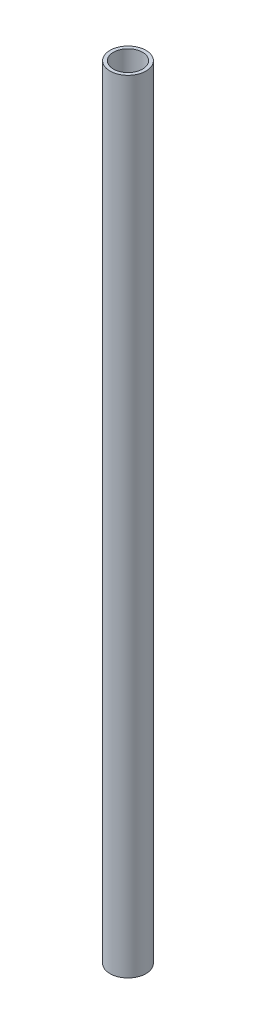
ISO-10303-21;
HEADER;
FILE_DESCRIPTION(('STEP AP214'),'2;1');
FILE_NAME('part.step','',(''),(''),'','','');
FILE_SCHEMA(('AUTOMOTIVE_DESIGN { 1 0 10303 214 1 1 1 1 }'));
ENDSEC;
DATA;
#1=APPLICATION_CONTEXT('core data for automotive mechanical design processes');
#2=APPLICATION_PROTOCOL_DEFINITION('international standard','automotive_design',2000,#1);
#3=PRODUCT_CONTEXT('',#1,'mechanical');
#4=PRODUCT('Part','Part','',(#3));
#5=PRODUCT_RELATED_PRODUCT_CATEGORY('part','',(#4));
#6=PRODUCT_DEFINITION_FORMATION('','',#4);
#7=PRODUCT_DEFINITION_CONTEXT('part definition',#1,'design');
#8=PRODUCT_DEFINITION('design','',#6,#7);
#9=PRODUCT_DEFINITION_SHAPE('','',#8);
#10=(LENGTH_UNIT() NAMED_UNIT(*) SI_UNIT(.MILLI.,.METRE.));
#11=(NAMED_UNIT(*) PLANE_ANGLE_UNIT() SI_UNIT($,.RADIAN.));
#12=(NAMED_UNIT(*) SI_UNIT($,.STERADIAN.) SOLID_ANGLE_UNIT());
#13=UNCERTAINTY_MEASURE_WITH_UNIT(LENGTH_MEASURE(1.E-05),#10,'distance_accuracy_value','');
#14=(GEOMETRIC_REPRESENTATION_CONTEXT(3) GLOBAL_UNCERTAINTY_ASSIGNED_CONTEXT((#13)) GLOBAL_UNIT_ASSIGNED_CONTEXT((#10,
#11,#12)) REPRESENTATION_CONTEXT('',''));
#15=CARTESIAN_POINT('',(0.,0.,0.));
#16=DIRECTION('',(0.,0.,1.));
#17=DIRECTION('',(1.,0.,0.));
#18=AXIS2_PLACEMENT_3D('',#15,#16,#17);
#19=CARTESIAN_POINT('',(0.,348.,0.));
#20=DIRECTION('',(0.,1.,0.));
#21=DIRECTION('',(0.,0.,1.));
#22=AXIS2_PLACEMENT_3D('',#19,#20,#21);
#23=PLANE('',#22);
#24=CARTESIAN_POINT('',(0.,348.,0.));
#25=DIRECTION('',(0.,1.,0.));
#26=DIRECTION('',(0.,0.,1.));
#27=AXIS2_PLACEMENT_3D('',#24,#25,#26);
#28=CIRCLE('',#27,8.);
#29=CARTESIAN_POINT('',(0.,348.,8.));
#30=VERTEX_POINT('',#29);
#31=EDGE_CURVE('E10',#30,#30,#28,.T.);
#32=ORIENTED_EDGE('',*,*,#31,.T.);
#33=EDGE_LOOP('',(#32));
#34=FACE_BOUND('',#33,.T.);
#35=CARTESIAN_POINT('',(0.,348.,0.));
#36=DIRECTION('',(0.,1.,0.));
#37=DIRECTION('',(0.,0.,1.));
#38=AXIS2_PLACEMENT_3D('',#35,#36,#37);
#39=CIRCLE('',#38,6.5);
#40=CARTESIAN_POINT('',(0.,348.,6.5));
#41=VERTEX_POINT('',#40);
#42=EDGE_CURVE('E48',#41,#41,#39,.T.);
#43=ORIENTED_EDGE('',*,*,#42,.F.);
#44=EDGE_LOOP('',(#43));
#45=FACE_BOUND('',#44,.T.);
#46=ADVANCED_FACE('F37',(#34,#45),#23,.T.);
#47=CARTESIAN_POINT('',(0.,0.,0.));
#48=DIRECTION('',(0.,1.,0.));
#49=DIRECTION('',(0.,0.,1.));
#50=AXIS2_PLACEMENT_3D('',#47,#48,#49);
#51=PLANE('',#50);
#52=CARTESIAN_POINT('',(0.,0.,0.));
#53=DIRECTION('',(0.,1.,0.));
#54=DIRECTION('',(0.,0.,1.));
#55=AXIS2_PLACEMENT_3D('',#52,#53,#54);
#56=CIRCLE('',#55,8.);
#57=CARTESIAN_POINT('',(0.,0.,8.));
#58=VERTEX_POINT('',#57);
#59=EDGE_CURVE('E41',#58,#58,#56,.T.);
#60=ORIENTED_EDGE('',*,*,#59,.F.);
#61=EDGE_LOOP('',(#60));
#62=FACE_BOUND('',#61,.T.);
#63=CARTESIAN_POINT('',(0.,0.,0.));
#64=DIRECTION('',(0.,1.,0.));
#65=DIRECTION('',(0.,0.,1.));
#66=AXIS2_PLACEMENT_3D('',#63,#64,#65);
#67=CIRCLE('',#66,6.5);
#68=CARTESIAN_POINT('',(0.,0.,6.5));
#69=VERTEX_POINT('',#68);
#70=EDGE_CURVE('E50',#69,#69,#67,.T.);
#71=ORIENTED_EDGE('',*,*,#70,.T.);
#72=EDGE_LOOP('',(#71));
#73=FACE_BOUND('',#72,.T.);
#74=ADVANCED_FACE('F60',(#62,#73),#51,.F.);
#75=CARTESIAN_POINT('',(0.,348.,0.));
#76=DIRECTION('',(0.,-1.,0.));
#77=DIRECTION('',(0.,0.,-1.));
#78=AXIS2_PLACEMENT_3D('',#75,#76,#77);
#79=CYLINDRICAL_SURFACE('',#78,8.);
#80=ORIENTED_EDGE('',*,*,#31,.F.);
#81=EDGE_LOOP('',(#80));
#82=FACE_BOUND('',#81,.T.);
#83=ORIENTED_EDGE('',*,*,#59,.T.);
#84=EDGE_LOOP('',(#83));
#85=FACE_BOUND('',#84,.T.);
#86=ADVANCED_FACE('F39',(#82,#85),#79,.T.);
#87=CARTESIAN_POINT('',(0.,348.,0.));
#88=DIRECTION('',(0.,-1.,0.));
#89=DIRECTION('',(0.,0.,-1.));
#90=AXIS2_PLACEMENT_3D('',#87,#88,#89);
#91=CYLINDRICAL_SURFACE('',#90,6.5);
#92=ORIENTED_EDGE('',*,*,#42,.T.);
#93=EDGE_LOOP('',(#92));
#94=FACE_BOUND('',#93,.T.);
#95=ORIENTED_EDGE('',*,*,#70,.F.);
#96=EDGE_LOOP('',(#95));
#97=FACE_BOUND('',#96,.T.);
#98=ADVANCED_FACE('F56',(#94,#97),#91,.F.);
#99=CLOSED_SHELL('',(#46,#74,#86,#98));
#100=MANIFOLD_SOLID_BREP('B2',#99);
#101=ADVANCED_BREP_SHAPE_REPRESENTATION('',(#18,#100),#14);
#102=SHAPE_DEFINITION_REPRESENTATION(#9,#101);
ENDSEC;
END-ISO-10303-21;
